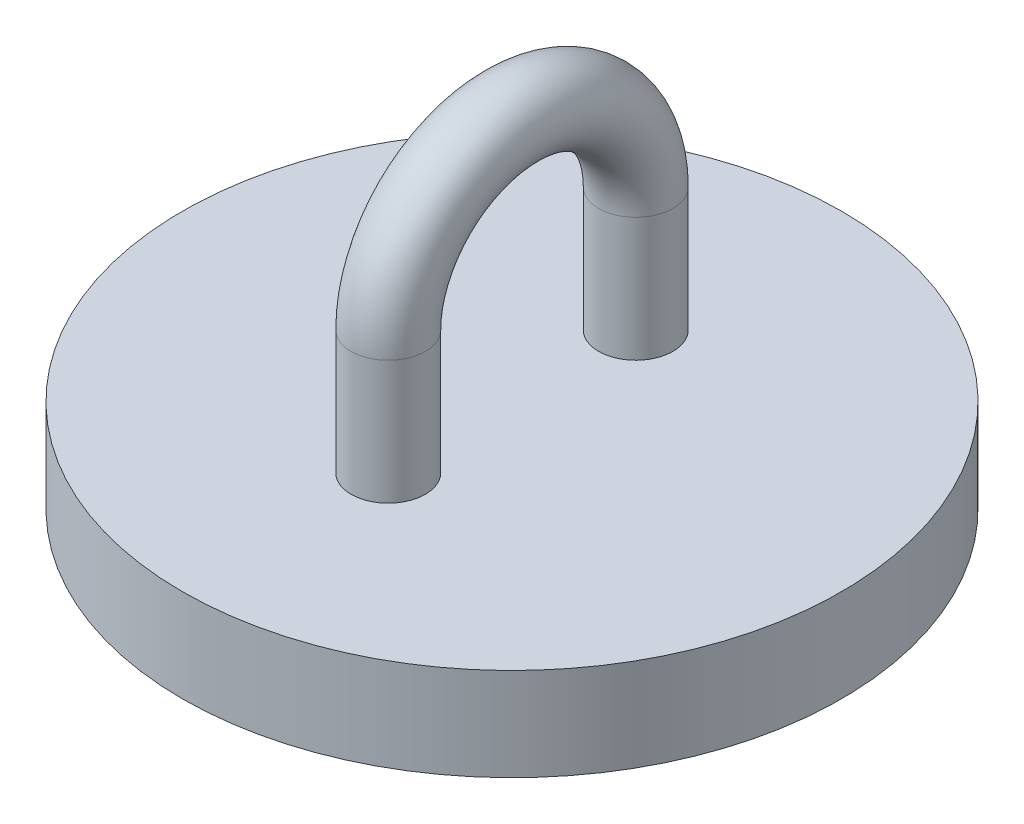
ISO-10303-21;
HEADER;
FILE_DESCRIPTION(('STEP AP214'),'2;1');
FILE_NAME('part.step','',(''),(''),'','','');
FILE_SCHEMA(('AUTOMOTIVE_DESIGN { 1 0 10303 214 1 1 1 1 }'));
ENDSEC;
DATA;
#1=APPLICATION_CONTEXT('core data for automotive mechanical design processes');
#2=APPLICATION_PROTOCOL_DEFINITION('international standard','automotive_design',2000,#1);
#3=PRODUCT_CONTEXT('',#1,'mechanical');
#4=PRODUCT('Part','Part','',(#3));
#5=PRODUCT_RELATED_PRODUCT_CATEGORY('part','',(#4));
#6=PRODUCT_DEFINITION_FORMATION('','',#4);
#7=PRODUCT_DEFINITION_CONTEXT('part definition',#1,'design');
#8=PRODUCT_DEFINITION('design','',#6,#7);
#9=PRODUCT_DEFINITION_SHAPE('','',#8);
#10=(LENGTH_UNIT() NAMED_UNIT(*) SI_UNIT(.MILLI.,.METRE.));
#11=(NAMED_UNIT(*) PLANE_ANGLE_UNIT() SI_UNIT($,.RADIAN.));
#12=(NAMED_UNIT(*) SI_UNIT($,.STERADIAN.) SOLID_ANGLE_UNIT());
#13=UNCERTAINTY_MEASURE_WITH_UNIT(LENGTH_MEASURE(1.E-05),#10,'distance_accuracy_value','');
#14=(GEOMETRIC_REPRESENTATION_CONTEXT(3) GLOBAL_UNCERTAINTY_ASSIGNED_CONTEXT((#13)) GLOBAL_UNIT_ASSIGNED_CONTEXT((#10,
#11,#12)) REPRESENTATION_CONTEXT('',''));
#15=CARTESIAN_POINT('',(0.,0.,0.));
#16=DIRECTION('',(0.,0.,1.));
#17=DIRECTION('',(1.,0.,0.));
#18=AXIS2_PLACEMENT_3D('',#15,#16,#17);
#19=CARTESIAN_POINT('',(0.,3.,0.));
#20=DIRECTION('',(0.,1.,0.));
#21=DIRECTION('',(0.,0.,1.));
#22=AXIS2_PLACEMENT_3D('',#19,#20,#21);
#23=PLANE('',#22);
#24=CARTESIAN_POINT('',(0.,3.,0.));
#25=DIRECTION('',(0.,1.,0.));
#26=DIRECTION('',(0.,0.,1.));
#27=AXIS2_PLACEMENT_3D('',#24,#25,#26);
#28=CIRCLE('',#27,10.65);
#29=CARTESIAN_POINT('',(0.,3.,10.65));
#30=VERTEX_POINT('',#29);
#31=EDGE_CURVE('E46',#30,#30,#28,.T.);
#32=ORIENTED_EDGE('',*,*,#31,.T.);
#33=EDGE_LOOP('',(#32));
#34=FACE_BOUND('',#33,.T.);
#35=CARTESIAN_POINT('',(0.,3.,4.));
#36=DIRECTION('',(0.,1.,0.));
#37=DIRECTION('',(0.,0.,1.));
#38=AXIS2_PLACEMENT_3D('',#35,#36,#37);
#39=CIRCLE('',#38,1.2);
#40=CARTESIAN_POINT('',(0.,3.,5.2));
#41=VERTEX_POINT('',#40);
#42=EDGE_CURVE('E10',#41,#41,#39,.T.);
#43=ORIENTED_EDGE('',*,*,#42,.F.);
#44=EDGE_LOOP('',(#43));
#45=FACE_BOUND('',#44,.T.);
#46=CARTESIAN_POINT('',(0.,3.,-4.));
#47=DIRECTION('',(0.,-1.,0.));
#48=DIRECTION('',(0.,0.,-1.));
#49=AXIS2_PLACEMENT_3D('',#46,#47,#48);
#50=CIRCLE('',#49,1.2);
#51=CARTESIAN_POINT('',(0.,3.,-5.2));
#52=VERTEX_POINT('',#51);
#53=EDGE_CURVE('E61',#52,#52,#50,.T.);
#54=ORIENTED_EDGE('',*,*,#53,.T.);
#55=EDGE_LOOP('',(#54));
#56=FACE_BOUND('',#55,.T.);
#57=ADVANCED_FACE('F37',(#34,#45,#56),#23,.T.);
#58=CARTESIAN_POINT('',(0.,3.,0.));
#59=DIRECTION('',(0.,-1.,0.));
#60=DIRECTION('',(0.,0.,-1.));
#61=AXIS2_PLACEMENT_3D('',#58,#59,#60);
#62=CYLINDRICAL_SURFACE('',#61,10.65);
#63=ORIENTED_EDGE('',*,*,#31,.F.);
#64=EDGE_LOOP('',(#63));
#65=FACE_BOUND('',#64,.T.);
#66=CARTESIAN_POINT('',(0.,0.,0.));
#67=DIRECTION('',(0.,1.,0.));
#68=DIRECTION('',(0.,0.,1.));
#69=AXIS2_PLACEMENT_3D('',#66,#67,#68);
#70=CIRCLE('',#69,10.65);
#71=CARTESIAN_POINT('',(0.,0.,10.65));
#72=VERTEX_POINT('',#71);
#73=EDGE_CURVE('E41',#72,#72,#70,.T.);
#74=ORIENTED_EDGE('',*,*,#73,.T.);
#75=EDGE_LOOP('',(#74));
#76=FACE_BOUND('',#75,.T.);
#77=ADVANCED_FACE('F39',(#65,#76),#62,.T.);
#78=CARTESIAN_POINT('',(0.,0.,0.));
#79=DIRECTION('',(0.,1.,0.));
#80=DIRECTION('',(0.,0.,1.));
#81=AXIS2_PLACEMENT_3D('',#78,#79,#80);
#82=PLANE('',#81);
#83=ORIENTED_EDGE('',*,*,#73,.F.);
#84=EDGE_LOOP('',(#83));
#85=FACE_BOUND('',#84,.T.);
#86=ADVANCED_FACE('F71',(#85),#82,.F.);
#87=CARTESIAN_POINT('',(0.,3.,4.));
#88=DIRECTION('',(0.,1.,0.));
#89=DIRECTION('',(0.,0.,1.));
#90=AXIS2_PLACEMENT_3D('',#87,#88,#89);
#91=CYLINDRICAL_SURFACE('',#90,1.2);
#92=CARTESIAN_POINT('',(0.,7.,4.));
#93=DIRECTION('',(0.,1.,0.));
#94=DIRECTION('',(0.,0.,1.));
#95=AXIS2_PLACEMENT_3D('',#92,#93,#94);
#96=CIRCLE('',#95,1.2);
#97=CARTESIAN_POINT('',(0.,7.,5.2));
#98=VERTEX_POINT('',#97);
#99=EDGE_CURVE('E53',#98,#98,#96,.T.);
#100=ORIENTED_EDGE('',*,*,#99,.F.);
#101=EDGE_LOOP('',(#100));
#102=FACE_BOUND('',#101,.T.);
#103=ORIENTED_EDGE('',*,*,#42,.T.);
#104=EDGE_LOOP('',(#103));
#105=FACE_BOUND('',#104,.T.);
#106=ADVANCED_FACE('F73',(#102,#105),#91,.T.);
#107=CARTESIAN_POINT('',(0.,7.,0.));
#108=DIRECTION('',(-1.,0.,0.));
#109=DIRECTION('',(0.,0.,1.));
#110=AXIS2_PLACEMENT_3D('',#107,#108,#109);
#111=TOROIDAL_SURFACE('',#110,4.,1.2);
#112=CARTESIAN_POINT('',(0.,7.,-4.));
#113=DIRECTION('',(0.,-1.,0.));
#114=DIRECTION('',(0.,0.,-1.));
#115=AXIS2_PLACEMENT_3D('',#112,#113,#114);
#116=CIRCLE('',#115,1.2);
#117=CARTESIAN_POINT('',(0.,7.,-5.2));
#118=VERTEX_POINT('',#117);
#119=EDGE_CURVE('E57',#118,#118,#116,.T.);
#120=CARTESIAN_POINT('',(0.,7.,0.));
#121=DIRECTION('',(-1.,0.,0.));
#122=DIRECTION('',(0.,0.,1.));
#123=AXIS2_PLACEMENT_3D('',#120,#121,#122);
#124=CIRCLE('',#123,5.2);
#125=EDGE_CURVE('',#98,#118,#124,.T.);
#126=ORIENTED_EDGE('',*,*,#99,.T.);
#127=ORIENTED_EDGE('',*,*,#119,.F.);
#128=ORIENTED_EDGE('',*,*,#125,.T.);
#129=ORIENTED_EDGE('',*,*,#125,.F.);
#130=EDGE_LOOP('',(#126,#128,#127,#129));
#131=FACE_BOUND('',#130,.T.);
#132=ADVANCED_FACE('F79',(#131),#111,.T.);
#133=CARTESIAN_POINT('',(0.,7.,-4.));
#134=DIRECTION('',(0.,-1.,0.));
#135=DIRECTION('',(0.,0.,-1.));
#136=AXIS2_PLACEMENT_3D('',#133,#134,#135);
#137=CYLINDRICAL_SURFACE('',#136,1.2);
#138=ORIENTED_EDGE('',*,*,#53,.F.);
#139=EDGE_LOOP('',(#138));
#140=FACE_BOUND('',#139,.T.);
#141=ORIENTED_EDGE('',*,*,#119,.T.);
#142=EDGE_LOOP('',(#141));
#143=FACE_BOUND('',#142,.T.);
#144=ADVANCED_FACE('F74',(#140,#143),#137,.T.);
#145=CLOSED_SHELL('',(#57,#77,#86,#106,#132,#144));
#146=MANIFOLD_SOLID_BREP('B2',#145);
#147=ADVANCED_BREP_SHAPE_REPRESENTATION('',(#18,#146),#14);
#148=SHAPE_DEFINITION_REPRESENTATION(#9,#147);
ENDSEC;
END-ISO-10303-21;
